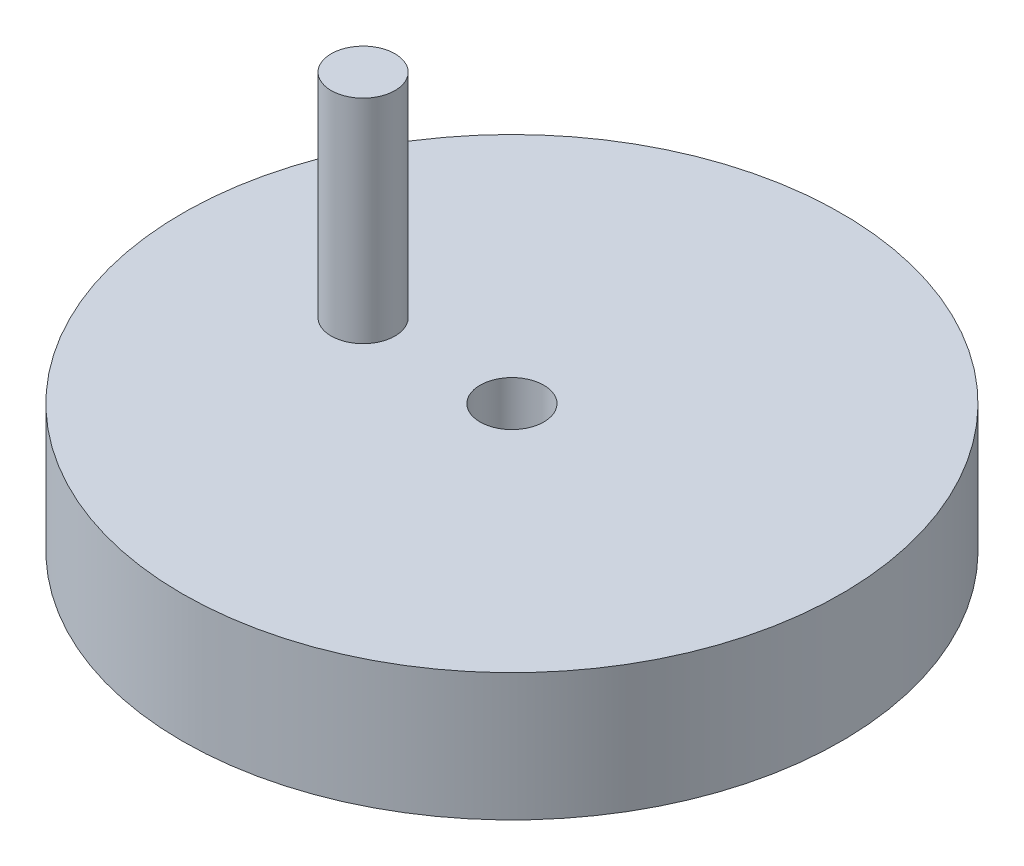
ISO-10303-21;
HEADER;
FILE_DESCRIPTION(('STEP AP214'),'2;1');
FILE_NAME('part.step','',(''),(''),'','','');
FILE_SCHEMA(('AUTOMOTIVE_DESIGN { 1 0 10303 214 1 1 1 1 }'));
ENDSEC;
DATA;
#1=APPLICATION_CONTEXT('core data for automotive mechanical design processes');
#2=APPLICATION_PROTOCOL_DEFINITION('international standard','automotive_design',2000,#1);
#3=PRODUCT_CONTEXT('',#1,'mechanical');
#4=PRODUCT('Part','Part','',(#3));
#5=PRODUCT_RELATED_PRODUCT_CATEGORY('part','',(#4));
#6=PRODUCT_DEFINITION_FORMATION('','',#4);
#7=PRODUCT_DEFINITION_CONTEXT('part definition',#1,'design');
#8=PRODUCT_DEFINITION('design','',#6,#7);
#9=PRODUCT_DEFINITION_SHAPE('','',#8);
#10=(LENGTH_UNIT() NAMED_UNIT(*) SI_UNIT(.MILLI.,.METRE.));
#11=(NAMED_UNIT(*) PLANE_ANGLE_UNIT() SI_UNIT($,.RADIAN.));
#12=(NAMED_UNIT(*) SI_UNIT($,.STERADIAN.) SOLID_ANGLE_UNIT());
#13=UNCERTAINTY_MEASURE_WITH_UNIT(LENGTH_MEASURE(1.E-05),#10,'distance_accuracy_value','');
#14=(GEOMETRIC_REPRESENTATION_CONTEXT(3) GLOBAL_UNCERTAINTY_ASSIGNED_CONTEXT((#13)) GLOBAL_UNIT_ASSIGNED_CONTEXT((#10,
#11,#12)) REPRESENTATION_CONTEXT('',''));
#15=CARTESIAN_POINT('',(0.,0.,0.));
#16=DIRECTION('',(0.,0.,1.));
#17=DIRECTION('',(1.,0.,0.));
#18=AXIS2_PLACEMENT_3D('',#15,#16,#17);
#19=CARTESIAN_POINT('',(0.,12.,0.));
#20=DIRECTION('',(0.,-1.,0.));
#21=DIRECTION('',(0.,0.,-1.));
#22=AXIS2_PLACEMENT_3D('',#19,#20,#21);
#23=CYLINDRICAL_SURFACE('',#22,31.);
#24=CARTESIAN_POINT('',(0.,12.,0.));
#25=DIRECTION('',(0.,1.,0.));
#26=DIRECTION('',(0.,0.,1.));
#27=AXIS2_PLACEMENT_3D('',#24,#25,#26);
#28=CIRCLE('',#27,31.);
#29=CARTESIAN_POINT('',(0.,12.,31.));
#30=VERTEX_POINT('',#29);
#31=EDGE_CURVE('E10',#30,#30,#28,.T.);
#32=ORIENTED_EDGE('',*,*,#31,.F.);
#33=EDGE_LOOP('',(#32));
#34=FACE_BOUND('',#33,.T.);
#35=CARTESIAN_POINT('',(0.,0.,0.));
#36=DIRECTION('',(0.,1.,0.));
#37=DIRECTION('',(0.,0.,1.));
#38=AXIS2_PLACEMENT_3D('',#35,#36,#37);
#39=CIRCLE('',#38,31.);
#40=CARTESIAN_POINT('',(0.,0.,31.));
#41=VERTEX_POINT('',#40);
#42=EDGE_CURVE('E34',#41,#41,#39,.T.);
#43=ORIENTED_EDGE('',*,*,#42,.T.);
#44=EDGE_LOOP('',(#43));
#45=FACE_BOUND('',#44,.T.);
#46=ADVANCED_FACE('F31',(#34,#45),#23,.T.);
#47=CARTESIAN_POINT('',(0.,12.,0.));
#48=DIRECTION('',(0.,1.,0.));
#49=DIRECTION('',(0.,0.,1.));
#50=AXIS2_PLACEMENT_3D('',#47,#48,#49);
#51=PLANE('',#50);
#52=CARTESIAN_POINT('',(-14.,12.,0.));
#53=DIRECTION('',(0.,1.,0.));
#54=DIRECTION('',(0.,0.,1.));
#55=AXIS2_PLACEMENT_3D('',#52,#53,#54);
#56=CIRCLE('',#55,3.);
#57=CARTESIAN_POINT('',(-14.,12.,3.));
#58=VERTEX_POINT('',#57);
#59=EDGE_CURVE('E49',#58,#58,#56,.T.);
#60=ORIENTED_EDGE('',*,*,#59,.F.);
#61=EDGE_LOOP('',(#60));
#62=FACE_BOUND('',#61,.T.);
#63=CARTESIAN_POINT('',(0.,12.,0.));
#64=DIRECTION('',(0.,1.,0.));
#65=DIRECTION('',(0.,0.,1.));
#66=AXIS2_PLACEMENT_3D('',#63,#64,#65);
#67=CIRCLE('',#66,3.);
#68=CARTESIAN_POINT('',(0.,12.,3.));
#69=VERTEX_POINT('',#68);
#70=EDGE_CURVE('E43',#69,#69,#67,.T.);
#71=ORIENTED_EDGE('',*,*,#70,.F.);
#72=EDGE_LOOP('',(#71));
#73=FACE_BOUND('',#72,.T.);
#74=ORIENTED_EDGE('',*,*,#31,.T.);
#75=EDGE_LOOP('',(#74));
#76=FACE_BOUND('',#75,.T.);
#77=ADVANCED_FACE('F64',(#62,#73,#76),#51,.T.);
#78=CARTESIAN_POINT('',(0.,0.,0.));
#79=DIRECTION('',(0.,1.,0.));
#80=DIRECTION('',(0.,0.,1.));
#81=AXIS2_PLACEMENT_3D('',#78,#79,#80);
#82=PLANE('',#81);
#83=CARTESIAN_POINT('',(0.,0.,0.));
#84=DIRECTION('',(0.,1.,0.));
#85=DIRECTION('',(0.,0.,1.));
#86=AXIS2_PLACEMENT_3D('',#83,#84,#85);
#87=CIRCLE('',#86,3.);
#88=CARTESIAN_POINT('',(0.,0.,3.));
#89=VERTEX_POINT('',#88);
#90=EDGE_CURVE('E41',#89,#89,#87,.T.);
#91=ORIENTED_EDGE('',*,*,#90,.T.);
#92=EDGE_LOOP('',(#91));
#93=FACE_BOUND('',#92,.T.);
#94=ORIENTED_EDGE('',*,*,#42,.F.);
#95=EDGE_LOOP('',(#94));
#96=FACE_BOUND('',#95,.T.);
#97=ADVANCED_FACE('F67',(#93,#96),#82,.F.);
#98=CARTESIAN_POINT('',(0.,0.,0.));
#99=DIRECTION('',(0.,1.,0.));
#100=DIRECTION('',(0.,0.,1.));
#101=AXIS2_PLACEMENT_3D('',#98,#99,#100);
#102=CYLINDRICAL_SURFACE('',#101,3.);
#103=ORIENTED_EDGE('',*,*,#90,.F.);
#104=EDGE_LOOP('',(#103));
#105=FACE_BOUND('',#104,.T.);
#106=ORIENTED_EDGE('',*,*,#70,.T.);
#107=EDGE_LOOP('',(#106));
#108=FACE_BOUND('',#107,.T.);
#109=ADVANCED_FACE('F60',(#105,#108),#102,.F.);
#110=CARTESIAN_POINT('',(-14.,32.,0.));
#111=DIRECTION('',(0.,-1.,0.));
#112=DIRECTION('',(0.,0.,-1.));
#113=AXIS2_PLACEMENT_3D('',#110,#111,#112);
#114=CYLINDRICAL_SURFACE('',#113,3.);
#115=CARTESIAN_POINT('',(-14.,32.,0.));
#116=DIRECTION('',(0.,1.,0.));
#117=DIRECTION('',(0.,0.,1.));
#118=AXIS2_PLACEMENT_3D('',#115,#116,#117);
#119=CIRCLE('',#118,3.);
#120=CARTESIAN_POINT('',(-14.,32.,3.));
#121=VERTEX_POINT('',#120);
#122=EDGE_CURVE('E46',#121,#121,#119,.T.);
#123=ORIENTED_EDGE('',*,*,#122,.F.);
#124=EDGE_LOOP('',(#123));
#125=FACE_BOUND('',#124,.T.);
#126=ORIENTED_EDGE('',*,*,#59,.T.);
#127=EDGE_LOOP('',(#126));
#128=FACE_BOUND('',#127,.T.);
#129=ADVANCED_FACE('F57',(#125,#128),#114,.T.);
#130=CARTESIAN_POINT('',(-14.,32.,0.));
#131=DIRECTION('',(0.,1.,0.));
#132=DIRECTION('',(0.,0.,1.));
#133=AXIS2_PLACEMENT_3D('',#130,#131,#132);
#134=PLANE('',#133);
#135=ORIENTED_EDGE('',*,*,#122,.T.);
#136=EDGE_LOOP('',(#135));
#137=FACE_BOUND('',#136,.T.);
#138=ADVANCED_FACE('F55',(#137),#134,.T.);
#139=CLOSED_SHELL('',(#46,#77,#97,#109,#129,#138));
#140=MANIFOLD_SOLID_BREP('B2',#139);
#141=ADVANCED_BREP_SHAPE_REPRESENTATION('',(#18,#140),#14);
#142=SHAPE_DEFINITION_REPRESENTATION(#9,#141);
ENDSEC;
END-ISO-10303-21;
